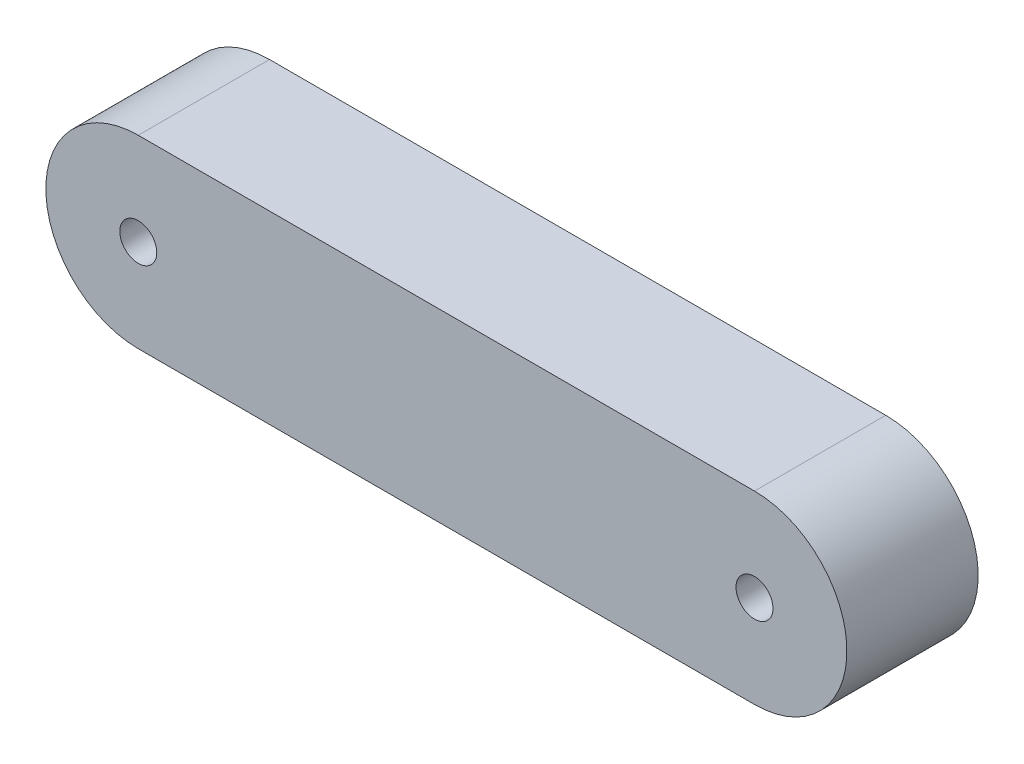
ISO-10303-21;
HEADER;
FILE_DESCRIPTION(('STEP AP214'),'2;1');
FILE_NAME('part.step','',(''),(''),'','','');
FILE_SCHEMA(('AUTOMOTIVE_DESIGN { 1 0 10303 214 1 1 1 1 }'));
ENDSEC;
DATA;
#1=APPLICATION_CONTEXT('core data for automotive mechanical design processes');
#2=APPLICATION_PROTOCOL_DEFINITION('international standard','automotive_design',2000,#1);
#3=PRODUCT_CONTEXT('',#1,'mechanical');
#4=PRODUCT('Part','Part','',(#3));
#5=PRODUCT_RELATED_PRODUCT_CATEGORY('part','',(#4));
#6=PRODUCT_DEFINITION_FORMATION('','',#4);
#7=PRODUCT_DEFINITION_CONTEXT('part definition',#1,'design');
#8=PRODUCT_DEFINITION('design','',#6,#7);
#9=PRODUCT_DEFINITION_SHAPE('','',#8);
#10=(LENGTH_UNIT() NAMED_UNIT(*) SI_UNIT(.MILLI.,.METRE.));
#11=(NAMED_UNIT(*) PLANE_ANGLE_UNIT() SI_UNIT($,.RADIAN.));
#12=(NAMED_UNIT(*) SI_UNIT($,.STERADIAN.) SOLID_ANGLE_UNIT());
#13=UNCERTAINTY_MEASURE_WITH_UNIT(LENGTH_MEASURE(1.E-05),#10,'distance_accuracy_value','');
#14=(GEOMETRIC_REPRESENTATION_CONTEXT(3) GLOBAL_UNCERTAINTY_ASSIGNED_CONTEXT((#13)) GLOBAL_UNIT_ASSIGNED_CONTEXT((#10,
#11,#12)) REPRESENTATION_CONTEXT('',''));
#15=CARTESIAN_POINT('',(0.,0.,0.));
#16=DIRECTION('',(0.,0.,1.));
#17=DIRECTION('',(1.,0.,0.));
#18=AXIS2_PLACEMENT_3D('',#15,#16,#17);
#19=CARTESIAN_POINT('',(-100.,0.,42.6));
#20=DIRECTION('',(0.,0.,1.));
#21=DIRECTION('',(1.,0.,0.));
#22=AXIS2_PLACEMENT_3D('',#19,#20,#21);
#23=PLANE('',#22);
#24=CARTESIAN_POINT('',(-100.,0.,42.6));
#25=DIRECTION('',(0.,0.,1.));
#26=DIRECTION('',(1.,0.,0.));
#27=AXIS2_PLACEMENT_3D('',#24,#25,#26);
#28=CIRCLE('',#27,6.);
#29=CARTESIAN_POINT('',(-94.,0.,42.6));
#30=VERTEX_POINT('',#29);
#31=EDGE_CURVE('E100',#30,#30,#28,.T.);
#32=ORIENTED_EDGE('',*,*,#31,.F.);
#33=EDGE_LOOP('',(#32));
#34=FACE_BOUND('',#33,.T.);
#35=CARTESIAN_POINT('',(-100.,0.,42.6));
#36=DIRECTION('',(0.,0.,1.));
#37=DIRECTION('',(1.,0.,0.));
#38=AXIS2_PLACEMENT_3D('',#35,#36,#37);
#39=CIRCLE('',#38,30.);
#40=CARTESIAN_POINT('',(-100.,30.,42.6));
#41=VERTEX_POINT('',#40);
#42=CARTESIAN_POINT('',(-100.,-30.,42.6));
#43=VERTEX_POINT('',#42);
#44=EDGE_CURVE('E85',#41,#43,#39,.T.);
#45=ORIENTED_EDGE('',*,*,#44,.T.);
#46=DIRECTION('',(1.,0.,0.));
#47=VECTOR('',#46,1.);
#48=CARTESIAN_POINT('',(-100.,-30.,42.6));
#49=LINE('',#48,#47);
#50=CARTESIAN_POINT('',(100.,-30.,42.6));
#51=VERTEX_POINT('',#50);
#52=EDGE_CURVE('E80',#43,#51,#49,.T.);
#53=ORIENTED_EDGE('',*,*,#52,.T.);
#54=CARTESIAN_POINT('',(100.,0.,42.6));
#55=DIRECTION('',(0.,0.,1.));
#56=DIRECTION('',(1.,0.,0.));
#57=AXIS2_PLACEMENT_3D('',#54,#55,#56);
#58=CIRCLE('',#57,30.);
#59=CARTESIAN_POINT('',(100.,30.0000000000001,42.6));
#60=VERTEX_POINT('',#59);
#61=EDGE_CURVE('E83',#51,#60,#58,.T.);
#62=ORIENTED_EDGE('',*,*,#61,.T.);
#63=DIRECTION('',(-1.,0.,0.));
#64=VECTOR('',#63,1.);
#65=CARTESIAN_POINT('',(-100.,30.,42.6));
#66=LINE('',#65,#64);
#67=EDGE_CURVE('E50',#60,#41,#66,.T.);
#68=ORIENTED_EDGE('',*,*,#67,.T.);
#69=EDGE_LOOP('',(#45,#53,#62,#68));
#70=FACE_BOUND('',#69,.T.);
#71=CARTESIAN_POINT('',(100.,0.,42.6));
#72=DIRECTION('',(0.,0.,1.));
#73=DIRECTION('',(1.,0.,0.));
#74=AXIS2_PLACEMENT_3D('',#71,#72,#73);
#75=CIRCLE('',#74,6.);
#76=CARTESIAN_POINT('',(106.,0.,42.6));
#77=VERTEX_POINT('',#76);
#78=EDGE_CURVE('E115',#77,#77,#75,.T.);
#79=ORIENTED_EDGE('',*,*,#78,.F.);
#80=EDGE_LOOP('',(#79));
#81=FACE_BOUND('',#80,.T.);
#82=ADVANCED_FACE('F33',(#34,#70,#81),#23,.T.);
#83=CARTESIAN_POINT('',(-100.,0.,0.));
#84=DIRECTION('',(0.,0.,1.));
#85=DIRECTION('',(1.,0.,0.));
#86=AXIS2_PLACEMENT_3D('',#83,#84,#85);
#87=PLANE('',#86);
#88=CARTESIAN_POINT('',(-100.,0.,0.));
#89=DIRECTION('',(0.,0.,1.));
#90=DIRECTION('',(1.,0.,0.));
#91=AXIS2_PLACEMENT_3D('',#88,#89,#90);
#92=CIRCLE('',#91,30.);
#93=CARTESIAN_POINT('',(-100.,30.,0.));
#94=VERTEX_POINT('',#93);
#95=CARTESIAN_POINT('',(-100.,-30.,0.));
#96=VERTEX_POINT('',#95);
#97=EDGE_CURVE('E97',#94,#96,#92,.T.);
#98=ORIENTED_EDGE('',*,*,#97,.F.);
#99=DIRECTION('',(-1.,0.,0.));
#100=VECTOR('',#99,1.);
#101=CARTESIAN_POINT('',(-100.,30.,0.));
#102=LINE('',#101,#100);
#103=CARTESIAN_POINT('',(100.,30.0000000000001,0.));
#104=VERTEX_POINT('',#103);
#105=EDGE_CURVE('E73',#104,#94,#102,.T.);
#106=ORIENTED_EDGE('',*,*,#105,.F.);
#107=CARTESIAN_POINT('',(100.,0.,0.));
#108=DIRECTION('',(0.,0.,1.));
#109=DIRECTION('',(1.,0.,0.));
#110=AXIS2_PLACEMENT_3D('',#107,#108,#109);
#111=CIRCLE('',#110,30.);
#112=CARTESIAN_POINT('',(100.,-30.,0.));
#113=VERTEX_POINT('',#112);
#114=EDGE_CURVE('E67',#113,#104,#111,.T.);
#115=ORIENTED_EDGE('',*,*,#114,.F.);
#116=DIRECTION('',(1.,0.,0.));
#117=VECTOR('',#116,1.);
#118=CARTESIAN_POINT('',(-100.,-30.,0.));
#119=LINE('',#118,#117);
#120=EDGE_CURVE('E89',#96,#113,#119,.T.);
#121=ORIENTED_EDGE('',*,*,#120,.F.);
#122=EDGE_LOOP('',(#98,#106,#115,#121));
#123=FACE_BOUND('',#122,.T.);
#124=CARTESIAN_POINT('',(-100.,0.,0.));
#125=DIRECTION('',(0.,0.,1.));
#126=DIRECTION('',(1.,0.,0.));
#127=AXIS2_PLACEMENT_3D('',#124,#125,#126);
#128=CIRCLE('',#127,6.);
#129=CARTESIAN_POINT('',(-94.,0.,0.));
#130=VERTEX_POINT('',#129);
#131=EDGE_CURVE('E112',#130,#130,#128,.T.);
#132=ORIENTED_EDGE('',*,*,#131,.T.);
#133=EDGE_LOOP('',(#132));
#134=FACE_BOUND('',#133,.T.);
#135=CARTESIAN_POINT('',(100.,0.,0.));
#136=DIRECTION('',(0.,0.,1.));
#137=DIRECTION('',(1.,0.,0.));
#138=AXIS2_PLACEMENT_3D('',#135,#136,#137);
#139=CIRCLE('',#138,6.);
#140=CARTESIAN_POINT('',(106.,0.,0.));
#141=VERTEX_POINT('',#140);
#142=EDGE_CURVE('E118',#141,#141,#139,.T.);
#143=ORIENTED_EDGE('',*,*,#142,.T.);
#144=EDGE_LOOP('',(#143));
#145=FACE_BOUND('',#144,.T.);
#146=ADVANCED_FACE('F108',(#123,#134,#145),#87,.F.);
#147=CARTESIAN_POINT('',(-100.,0.,42.6));
#148=DIRECTION('',(0.,0.,-1.));
#149=DIRECTION('',(-1.,0.,0.));
#150=AXIS2_PLACEMENT_3D('',#147,#148,#149);
#151=CYLINDRICAL_SURFACE('',#150,30.);
#152=ORIENTED_EDGE('',*,*,#97,.T.);
#153=DIRECTION('',(0.,0.,-1.));
#154=VECTOR('',#153,1.);
#155=CARTESIAN_POINT('',(-100.,-30.,42.6));
#156=LINE('',#155,#154);
#157=EDGE_CURVE('E11',#43,#96,#156,.T.);
#158=ORIENTED_EDGE('',*,*,#157,.F.);
#159=ORIENTED_EDGE('',*,*,#44,.F.);
#160=DIRECTION('',(0.,0.,-1.));
#161=VECTOR('',#160,1.);
#162=CARTESIAN_POINT('',(-100.,30.,42.6));
#163=LINE('',#162,#161);
#164=EDGE_CURVE('E93',#41,#94,#163,.T.);
#165=ORIENTED_EDGE('',*,*,#164,.T.);
#166=EDGE_LOOP('',(#152,#158,#159,#165));
#167=FACE_BOUND('',#166,.T.);
#168=ADVANCED_FACE('F35',(#167),#151,.T.);
#169=CARTESIAN_POINT('',(-100.,-30.,42.6));
#170=DIRECTION('',(0.,1.,0.));
#171=DIRECTION('',(-1.,0.,0.));
#172=AXIS2_PLACEMENT_3D('',#169,#170,#171);
#173=PLANE('',#172);
#174=ORIENTED_EDGE('',*,*,#120,.T.);
#175=DIRECTION('',(0.,0.,-1.));
#176=VECTOR('',#175,1.);
#177=CARTESIAN_POINT('',(100.,-30.,42.6));
#178=LINE('',#177,#176);
#179=EDGE_CURVE('E42',#51,#113,#178,.T.);
#180=ORIENTED_EDGE('',*,*,#179,.F.);
#181=ORIENTED_EDGE('',*,*,#52,.F.);
#182=ORIENTED_EDGE('',*,*,#157,.T.);
#183=EDGE_LOOP('',(#174,#180,#181,#182));
#184=FACE_BOUND('',#183,.T.);
#185=ADVANCED_FACE('F88',(#184),#173,.F.);
#186=CARTESIAN_POINT('',(100.,0.,42.6));
#187=DIRECTION('',(0.,0.,-1.));
#188=DIRECTION('',(-1.,0.,0.));
#189=AXIS2_PLACEMENT_3D('',#186,#187,#188);
#190=CYLINDRICAL_SURFACE('',#189,30.);
#191=ORIENTED_EDGE('',*,*,#114,.T.);
#192=DIRECTION('',(0.,0.,-1.));
#193=VECTOR('',#192,1.);
#194=CARTESIAN_POINT('',(100.,30.0000000000001,42.6));
#195=LINE('',#194,#193);
#196=EDGE_CURVE('E90',#60,#104,#195,.T.);
#197=ORIENTED_EDGE('',*,*,#196,.F.);
#198=ORIENTED_EDGE('',*,*,#61,.F.);
#199=ORIENTED_EDGE('',*,*,#179,.T.);
#200=EDGE_LOOP('',(#191,#197,#198,#199));
#201=FACE_BOUND('',#200,.T.);
#202=ADVANCED_FACE('F91',(#201),#190,.T.);
#203=CARTESIAN_POINT('',(-100.,30.,42.6));
#204=DIRECTION('',(0.,-1.,0.));
#205=DIRECTION('',(1.,0.,0.));
#206=AXIS2_PLACEMENT_3D('',#203,#204,#205);
#207=PLANE('',#206);
#208=ORIENTED_EDGE('',*,*,#105,.T.);
#209=ORIENTED_EDGE('',*,*,#164,.F.);
#210=ORIENTED_EDGE('',*,*,#67,.F.);
#211=ORIENTED_EDGE('',*,*,#196,.T.);
#212=EDGE_LOOP('',(#208,#209,#210,#211));
#213=FACE_BOUND('',#212,.T.);
#214=ADVANCED_FACE('F105',(#213),#207,.F.);
#215=CARTESIAN_POINT('',(-100.,0.,42.6));
#216=DIRECTION('',(0.,0.,-1.));
#217=DIRECTION('',(-1.,0.,0.));
#218=AXIS2_PLACEMENT_3D('',#215,#216,#217);
#219=CYLINDRICAL_SURFACE('',#218,6.);
#220=ORIENTED_EDGE('',*,*,#31,.T.);
#221=EDGE_LOOP('',(#220));
#222=FACE_BOUND('',#221,.T.);
#223=ORIENTED_EDGE('',*,*,#131,.F.);
#224=EDGE_LOOP('',(#223));
#225=FACE_BOUND('',#224,.T.);
#226=ADVANCED_FACE('F135',(#222,#225),#219,.F.);
#227=CARTESIAN_POINT('',(100.,0.,42.6));
#228=DIRECTION('',(0.,0.,-1.));
#229=DIRECTION('',(-1.,0.,0.));
#230=AXIS2_PLACEMENT_3D('',#227,#228,#229);
#231=CYLINDRICAL_SURFACE('',#230,6.);
#232=ORIENTED_EDGE('',*,*,#78,.T.);
#233=EDGE_LOOP('',(#232));
#234=FACE_BOUND('',#233,.T.);
#235=ORIENTED_EDGE('',*,*,#142,.F.);
#236=EDGE_LOOP('',(#235));
#237=FACE_BOUND('',#236,.T.);
#238=ADVANCED_FACE('F124',(#234,#237),#231,.F.);
#239=CLOSED_SHELL('',(#82,#146,#168,#185,#202,#214,#226,#238));
#240=MANIFOLD_SOLID_BREP('B2',#239);
#241=ADVANCED_BREP_SHAPE_REPRESENTATION('',(#18,#240),#14);
#242=SHAPE_DEFINITION_REPRESENTATION(#9,#241);
ENDSEC;
END-ISO-10303-21;
